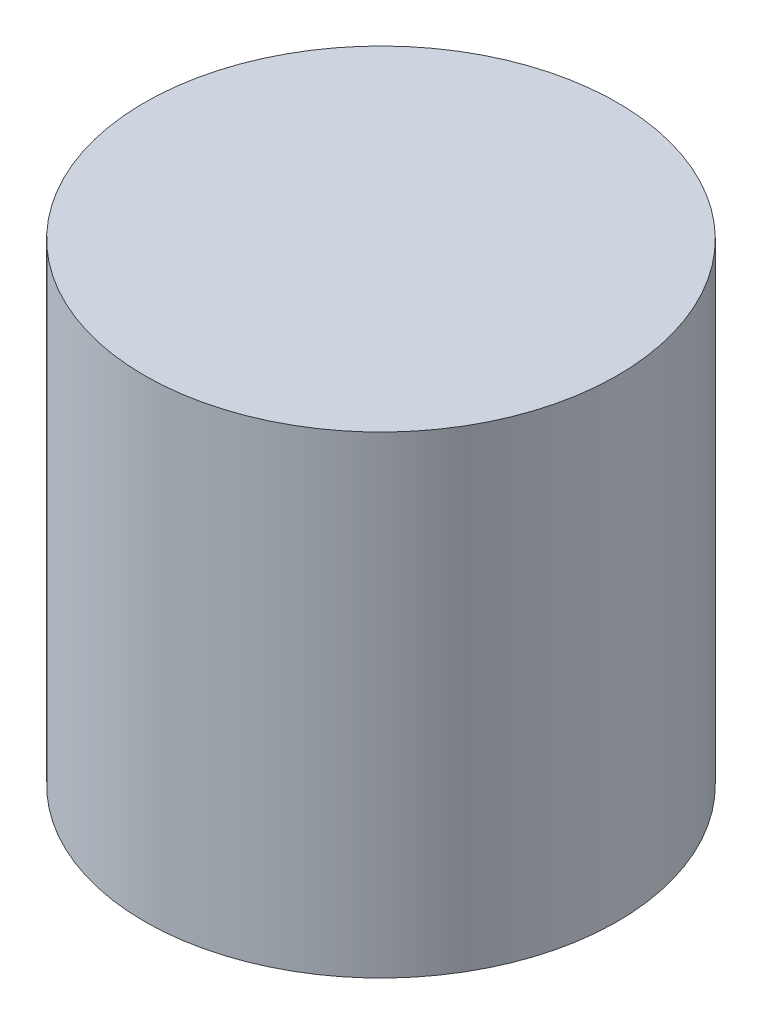
ISO-10303-21;
HEADER;
FILE_DESCRIPTION(('STEP AP214'),'2;1');
FILE_NAME('part.step','',(''),(''),'','','');
FILE_SCHEMA(('AUTOMOTIVE_DESIGN { 1 0 10303 214 1 1 1 1 }'));
ENDSEC;
DATA;
#1=APPLICATION_CONTEXT('core data for automotive mechanical design processes');
#2=APPLICATION_PROTOCOL_DEFINITION('international standard','automotive_design',2000,#1);
#3=PRODUCT_CONTEXT('',#1,'mechanical');
#4=PRODUCT('Part','Part','',(#3));
#5=PRODUCT_RELATED_PRODUCT_CATEGORY('part','',(#4));
#6=PRODUCT_DEFINITION_FORMATION('','',#4);
#7=PRODUCT_DEFINITION_CONTEXT('part definition',#1,'design');
#8=PRODUCT_DEFINITION('design','',#6,#7);
#9=PRODUCT_DEFINITION_SHAPE('','',#8);
#10=(LENGTH_UNIT() NAMED_UNIT(*) SI_UNIT(.MILLI.,.METRE.));
#11=(NAMED_UNIT(*) PLANE_ANGLE_UNIT() SI_UNIT($,.RADIAN.));
#12=(NAMED_UNIT(*) SI_UNIT($,.STERADIAN.) SOLID_ANGLE_UNIT());
#13=UNCERTAINTY_MEASURE_WITH_UNIT(LENGTH_MEASURE(1.E-05),#10,'distance_accuracy_value','');
#14=(GEOMETRIC_REPRESENTATION_CONTEXT(3) GLOBAL_UNCERTAINTY_ASSIGNED_CONTEXT((#13)) GLOBAL_UNIT_ASSIGNED_CONTEXT((#10,
#11,#12)) REPRESENTATION_CONTEXT('',''));
#15=CARTESIAN_POINT('',(0.,0.,0.));
#16=DIRECTION('',(0.,0.,1.));
#17=DIRECTION('',(1.,0.,0.));
#18=AXIS2_PLACEMENT_3D('',#15,#16,#17);
#19=CARTESIAN_POINT('',(0.,6.2484,0.));
#20=DIRECTION('',(0.,-1.,0.));
#21=DIRECTION('',(0.,0.,-1.));
#22=AXIS2_PLACEMENT_3D('',#19,#20,#21);
#23=CYLINDRICAL_SURFACE('',#22,3.1242);
#24=CARTESIAN_POINT('',(0.,6.2484,0.));
#25=DIRECTION('',(0.,1.,0.));
#26=DIRECTION('',(0.,0.,1.));
#27=AXIS2_PLACEMENT_3D('',#24,#25,#26);
#28=CIRCLE('',#27,3.1242);
#29=CARTESIAN_POINT('',(0.,6.2484,3.1242));
#30=VERTEX_POINT('',#29);
#31=EDGE_CURVE('E10',#30,#30,#28,.T.);
#32=ORIENTED_EDGE('',*,*,#31,.F.);
#33=EDGE_LOOP('',(#32));
#34=FACE_BOUND('',#33,.T.);
#35=CARTESIAN_POINT('',(0.,0.,0.));
#36=DIRECTION('',(0.,1.,0.));
#37=DIRECTION('',(0.,0.,1.));
#38=AXIS2_PLACEMENT_3D('',#35,#36,#37);
#39=CIRCLE('',#38,3.1242);
#40=CARTESIAN_POINT('',(0.,0.,3.1242));
#41=VERTEX_POINT('',#40);
#42=EDGE_CURVE('E35',#41,#41,#39,.T.);
#43=ORIENTED_EDGE('',*,*,#42,.T.);
#44=EDGE_LOOP('',(#43));
#45=FACE_BOUND('',#44,.T.);
#46=ADVANCED_FACE('F32',(#34,#45),#23,.T.);
#47=CARTESIAN_POINT('',(0.,6.2484,0.));
#48=DIRECTION('',(0.,1.,0.));
#49=DIRECTION('',(0.,0.,1.));
#50=AXIS2_PLACEMENT_3D('',#47,#48,#49);
#51=PLANE('',#50);
#52=ORIENTED_EDGE('',*,*,#31,.T.);
#53=EDGE_LOOP('',(#52));
#54=FACE_BOUND('',#53,.T.);
#55=ADVANCED_FACE('F47',(#54),#51,.T.);
#56=CARTESIAN_POINT('',(0.,0.,0.));
#57=DIRECTION('',(0.,1.,0.));
#58=DIRECTION('',(0.,0.,1.));
#59=AXIS2_PLACEMENT_3D('',#56,#57,#58);
#60=PLANE('',#59);
#61=ORIENTED_EDGE('',*,*,#42,.F.);
#62=EDGE_LOOP('',(#61));
#63=FACE_BOUND('',#62,.T.);
#64=ADVANCED_FACE('F45',(#63),#60,.F.);
#65=CLOSED_SHELL('',(#46,#55,#64));
#66=MANIFOLD_SOLID_BREP('B2',#65);
#67=ADVANCED_BREP_SHAPE_REPRESENTATION('',(#18,#66),#14);
#68=SHAPE_DEFINITION_REPRESENTATION(#9,#67);
ENDSEC;
END-ISO-10303-21;
